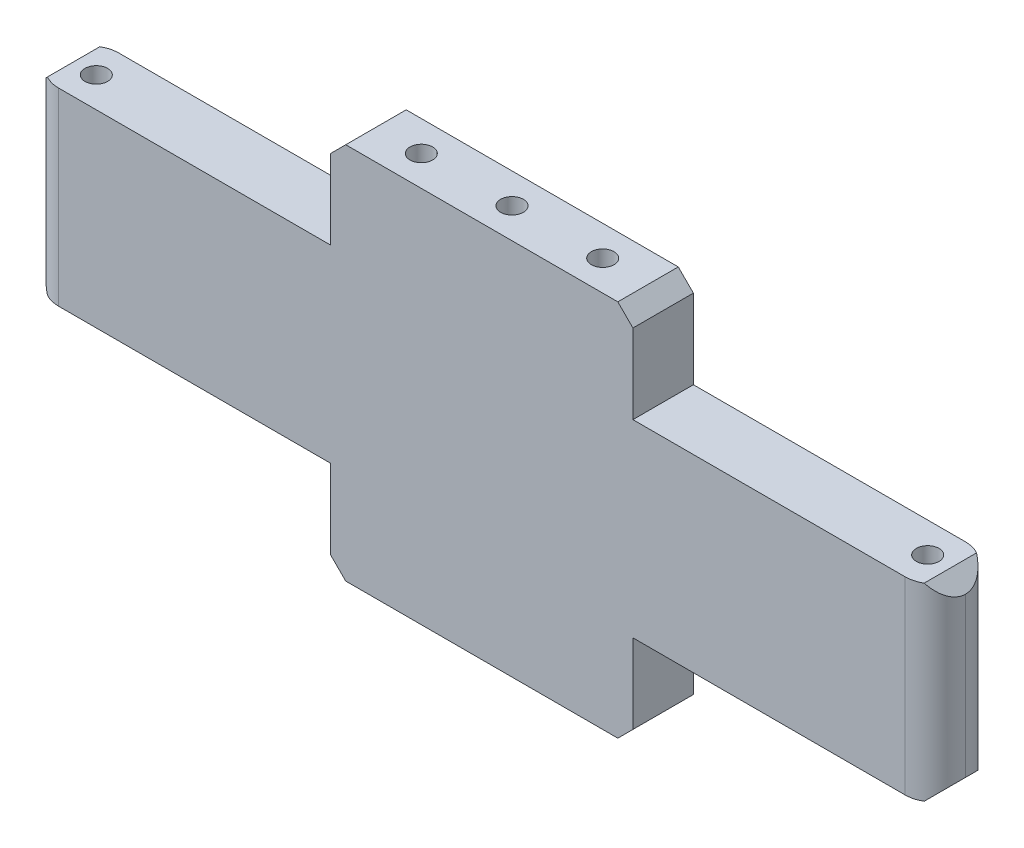
ISO-10303-21;
HEADER;
FILE_DESCRIPTION(('STEP AP214'),'2;1');
FILE_NAME('part.step','',(''),(''),'','','');
FILE_SCHEMA(('AUTOMOTIVE_DESIGN { 1 0 10303 214 1 1 1 1 }'));
ENDSEC;
DATA;
#1=APPLICATION_CONTEXT('core data for automotive mechanical design processes');
#2=APPLICATION_PROTOCOL_DEFINITION('international standard','automotive_design',2000,#1);
#3=PRODUCT_CONTEXT('',#1,'mechanical');
#4=PRODUCT('Part','Part','',(#3));
#5=PRODUCT_RELATED_PRODUCT_CATEGORY('part','',(#4));
#6=PRODUCT_DEFINITION_FORMATION('','',#4);
#7=PRODUCT_DEFINITION_CONTEXT('part definition',#1,'design');
#8=PRODUCT_DEFINITION('design','',#6,#7);
#9=PRODUCT_DEFINITION_SHAPE('','',#8);
#10=(LENGTH_UNIT() NAMED_UNIT(*) SI_UNIT(.MILLI.,.METRE.));
#11=(NAMED_UNIT(*) PLANE_ANGLE_UNIT() SI_UNIT($,.RADIAN.));
#12=(NAMED_UNIT(*) SI_UNIT($,.STERADIAN.) SOLID_ANGLE_UNIT());
#13=UNCERTAINTY_MEASURE_WITH_UNIT(LENGTH_MEASURE(1.E-05),#10,'distance_accuracy_value','');
#14=(GEOMETRIC_REPRESENTATION_CONTEXT(3) GLOBAL_UNCERTAINTY_ASSIGNED_CONTEXT((#13)) GLOBAL_UNIT_ASSIGNED_CONTEXT((#10,
#11,#12)) REPRESENTATION_CONTEXT('',''));
#15=CARTESIAN_POINT('',(0.,0.,0.));
#16=DIRECTION('',(0.,0.,1.));
#17=DIRECTION('',(1.,0.,0.));
#18=AXIS2_PLACEMENT_3D('',#15,#16,#17);
#19=CARTESIAN_POINT('',(-55.,-24.9999999999999,4.));
#20=DIRECTION('',(0.,1.,0.));
#21=DIRECTION('',(1.,0.,0.));
#22=AXIS2_PLACEMENT_3D('',#19,#20,#21);
#23=CYLINDRICAL_SURFACE('',#22,1.5);
#24=CARTESIAN_POINT('',(-55.,12.5000000000001,4.));
#25=DIRECTION('',(0.,-1.,0.));
#26=DIRECTION('',(1.,0.,0.));
#27=AXIS2_PLACEMENT_3D('',#24,#25,#26);
#28=CIRCLE('',#27,1.5);
#29=CARTESIAN_POINT('',(-53.5,12.5000000000001,4.));
#30=VERTEX_POINT('',#29);
#31=EDGE_CURVE('E50',#30,#30,#28,.T.);
#32=ORIENTED_EDGE('',*,*,#31,.F.);
#33=EDGE_LOOP('',(#32));
#34=FACE_BOUND('',#33,.T.);
#35=CARTESIAN_POINT('',(-55.,-12.4999999999999,4.));
#36=DIRECTION('',(0.,-1.,0.));
#37=DIRECTION('',(1.,0.,0.));
#38=AXIS2_PLACEMENT_3D('',#35,#36,#37);
#39=CIRCLE('',#38,1.5);
#40=CARTESIAN_POINT('',(-53.5,-12.4999999999999,4.));
#41=VERTEX_POINT('',#40);
#42=EDGE_CURVE('E11',#41,#41,#39,.T.);
#43=ORIENTED_EDGE('',*,*,#42,.T.);
#44=EDGE_LOOP('',(#43));
#45=FACE_BOUND('',#44,.T.);
#46=ADVANCED_FACE('F43',(#34,#45),#23,.F.);
#47=CARTESIAN_POINT('',(20.,-12.5,8.));
#48=DIRECTION('',(-1.,0.,0.));
#49=DIRECTION('',(0.,-1.,0.));
#50=AXIS2_PLACEMENT_3D('',#47,#48,#49);
#51=PLANE('',#50);
#52=DIRECTION('',(0.,1.,0.));
#53=VECTOR('',#52,1.);
#54=CARTESIAN_POINT('',(20.,-12.5,8.));
#55=LINE('',#54,#53);
#56=CARTESIAN_POINT('',(20.,-23.,8.));
#57=VERTEX_POINT('',#56);
#58=CARTESIAN_POINT('',(20.,-12.5,8.));
#59=VERTEX_POINT('',#58);
#60=EDGE_CURVE('E190',#57,#59,#55,.T.);
#61=ORIENTED_EDGE('',*,*,#60,.F.);
#62=DIRECTION('',(0.,0.,-1.));
#63=VECTOR('',#62,1.);
#64=CARTESIAN_POINT('',(20.,-23.,8.));
#65=LINE('',#64,#63);
#66=CARTESIAN_POINT('',(20.,-23.,0.));
#67=VERTEX_POINT('',#66);
#68=EDGE_CURVE('E218',#57,#67,#65,.T.);
#69=ORIENTED_EDGE('',*,*,#68,.T.);
#70=DIRECTION('',(0.,1.,0.));
#71=VECTOR('',#70,1.);
#72=CARTESIAN_POINT('',(20.,-12.5,0.));
#73=LINE('',#72,#71);
#74=CARTESIAN_POINT('',(20.,-12.5,0.));
#75=VERTEX_POINT('',#74);
#76=EDGE_CURVE('E216',#67,#75,#73,.T.);
#77=ORIENTED_EDGE('',*,*,#76,.T.);
#78=DIRECTION('',(0.,0.,-1.));
#79=VECTOR('',#78,1.);
#80=CARTESIAN_POINT('',(20.,-12.5,8.));
#81=LINE('',#80,#79);
#82=EDGE_CURVE('E208',#59,#75,#81,.T.);
#83=ORIENTED_EDGE('',*,*,#82,.F.);
#84=EDGE_LOOP('',(#61,#69,#77,#83));
#85=FACE_BOUND('',#84,.T.);
#86=ADVANCED_FACE('F214',(#85),#51,.F.);
#87=CARTESIAN_POINT('',(60.,-12.5,8.));
#88=DIRECTION('',(0.,1.,0.));
#89=DIRECTION('',(-1.,0.,0.));
#90=AXIS2_PLACEMENT_3D('',#87,#88,#89);
#91=PLANE('',#90);
#92=CARTESIAN_POINT('',(55.,-12.5,4.));
#93=DIRECTION('',(0.,1.,0.));
#94=DIRECTION('',(-1.,0.,0.));
#95=AXIS2_PLACEMENT_3D('',#92,#93,#94);
#96=CIRCLE('',#95,1.5);
#97=CARTESIAN_POINT('',(53.5,-12.5,4.));
#98=VERTEX_POINT('',#97);
#99=EDGE_CURVE('E314',#98,#98,#96,.T.);
#100=ORIENTED_EDGE('',*,*,#99,.T.);
#101=EDGE_LOOP('',(#100));
#102=FACE_BOUND('',#101,.T.);
#103=DIRECTION('',(1.,0.,0.));
#104=VECTOR('',#103,1.);
#105=CARTESIAN_POINT('',(60.,-12.5,0.));
#106=LINE('',#105,#104);
#107=CARTESIAN_POINT('',(56.,-12.5,0.));
#108=VERTEX_POINT('',#107);
#109=EDGE_CURVE('E380',#75,#108,#106,.T.);
#110=ORIENTED_EDGE('',*,*,#109,.T.);
#111=CARTESIAN_POINT('',(56.,-12.5,4.));
#112=DIRECTION('',(0.,1.,0.));
#113=DIRECTION('',(-1.,0.,0.));
#114=AXIS2_PLACEMENT_3D('',#111,#112,#113);
#115=CIRCLE('',#114,4.);
#116=CARTESIAN_POINT('',(58.,-12.5,0.535898384862246));
#117=VERTEX_POINT('',#116);
#118=EDGE_CURVE('E284',#108,#117,#115,.F.);
#119=ORIENTED_EDGE('',*,*,#118,.T.);
#120=DIRECTION('',(0.,0.,1.));
#121=VECTOR('',#120,1.);
#122=CARTESIAN_POINT('',(58.,-12.5,8.));
#123=LINE('',#122,#121);
#124=CARTESIAN_POINT('',(58.,-12.5,7.46410161513775));
#125=VERTEX_POINT('',#124);
#126=EDGE_CURVE('E262',#117,#125,#123,.T.);
#127=ORIENTED_EDGE('',*,*,#126,.T.);
#128=CARTESIAN_POINT('',(56.,-12.5,4.));
#129=DIRECTION('',(0.,1.,0.));
#130=DIRECTION('',(-1.,0.,0.));
#131=AXIS2_PLACEMENT_3D('',#128,#129,#130);
#132=CIRCLE('',#131,4.);
#133=CARTESIAN_POINT('',(56.,-12.5,8.));
#134=VERTEX_POINT('',#133);
#135=EDGE_CURVE('E211',#125,#134,#132,.F.);
#136=ORIENTED_EDGE('',*,*,#135,.T.);
#137=DIRECTION('',(1.,0.,0.));
#138=VECTOR('',#137,1.);
#139=CARTESIAN_POINT('',(60.,-12.5,8.));
#140=LINE('',#139,#138);
#141=EDGE_CURVE('E193',#59,#134,#140,.T.);
#142=ORIENTED_EDGE('',*,*,#141,.F.);
#143=ORIENTED_EDGE('',*,*,#82,.T.);
#144=EDGE_LOOP('',(#110,#119,#127,#136,#142,#143));
#145=FACE_BOUND('',#144,.T.);
#146=ADVANCED_FACE('F207',(#102,#145),#91,.F.);
#147=CARTESIAN_POINT('',(20.,12.5,8.));
#148=DIRECTION('',(0.,-1.,0.));
#149=DIRECTION('',(1.,0.,0.));
#150=AXIS2_PLACEMENT_3D('',#147,#148,#149);
#151=PLANE('',#150);
#152=CARTESIAN_POINT('',(55.,12.5,4.));
#153=DIRECTION('',(0.,1.,0.));
#154=DIRECTION('',(-1.,0.,0.));
#155=AXIS2_PLACEMENT_3D('',#152,#153,#154);
#156=CIRCLE('',#155,1.5);
#157=CARTESIAN_POINT('',(53.5,12.5,4.));
#158=VERTEX_POINT('',#157);
#159=EDGE_CURVE('E465',#158,#158,#156,.T.);
#160=ORIENTED_EDGE('',*,*,#159,.F.);
#161=EDGE_LOOP('',(#160));
#162=FACE_BOUND('',#161,.T.);
#163=DIRECTION('',(0.,0.,-1.));
#164=VECTOR('',#163,1.);
#165=CARTESIAN_POINT('',(58.,12.5,8.));
#166=LINE('',#165,#164);
#167=CARTESIAN_POINT('',(58.,12.5,7.46410161513776));
#168=VERTEX_POINT('',#167);
#169=CARTESIAN_POINT('',(58.,12.5,0.535898384862247));
#170=VERTEX_POINT('',#169);
#171=EDGE_CURVE('E259',#168,#170,#166,.T.);
#172=ORIENTED_EDGE('',*,*,#171,.T.);
#173=CARTESIAN_POINT('',(56.,12.5,4.));
#174=DIRECTION('',(0.,-1.,0.));
#175=DIRECTION('',(1.,0.,0.));
#176=AXIS2_PLACEMENT_3D('',#173,#174,#175);
#177=CIRCLE('',#176,4.);
#178=CARTESIAN_POINT('',(56.,12.5,0.));
#179=VERTEX_POINT('',#178);
#180=EDGE_CURVE('E275',#170,#179,#177,.F.);
#181=ORIENTED_EDGE('',*,*,#180,.T.);
#182=DIRECTION('',(-1.,0.,0.));
#183=VECTOR('',#182,1.);
#184=CARTESIAN_POINT('',(20.,12.5,0.));
#185=LINE('',#184,#183);
#186=CARTESIAN_POINT('',(20.,12.5,0.));
#187=VERTEX_POINT('',#186);
#188=EDGE_CURVE('E383',#179,#187,#185,.T.);
#189=ORIENTED_EDGE('',*,*,#188,.T.);
#190=DIRECTION('',(0.,0.,-1.));
#191=VECTOR('',#190,1.);
#192=CARTESIAN_POINT('',(20.,12.5,8.));
#193=LINE('',#192,#191);
#194=CARTESIAN_POINT('',(20.,12.5,8.));
#195=VERTEX_POINT('',#194);
#196=EDGE_CURVE('E219',#195,#187,#193,.T.);
#197=ORIENTED_EDGE('',*,*,#196,.F.);
#198=DIRECTION('',(-1.,0.,0.));
#199=VECTOR('',#198,1.);
#200=CARTESIAN_POINT('',(20.,12.5,8.));
#201=LINE('',#200,#199);
#202=CARTESIAN_POINT('',(56.,12.5,8.));
#203=VERTEX_POINT('',#202);
#204=EDGE_CURVE('E212',#203,#195,#201,.T.);
#205=ORIENTED_EDGE('',*,*,#204,.F.);
#206=CARTESIAN_POINT('',(56.,12.5,4.));
#207=DIRECTION('',(0.,-1.,0.));
#208=DIRECTION('',(1.,0.,0.));
#209=AXIS2_PLACEMENT_3D('',#206,#207,#208);
#210=CIRCLE('',#209,4.);
#211=EDGE_CURVE('E273',#203,#168,#210,.F.);
#212=ORIENTED_EDGE('',*,*,#211,.T.);
#213=EDGE_LOOP('',(#172,#181,#189,#197,#205,#212));
#214=FACE_BOUND('',#213,.T.);
#215=ADVANCED_FACE('F442',(#162,#214),#151,.F.);
#216=CARTESIAN_POINT('',(20.,25.,8.));
#217=DIRECTION('',(-1.,0.,0.));
#218=DIRECTION('',(0.,-1.,0.));
#219=AXIS2_PLACEMENT_3D('',#216,#217,#218);
#220=PLANE('',#219);
#221=DIRECTION('',(0.,1.,0.));
#222=VECTOR('',#221,1.);
#223=CARTESIAN_POINT('',(20.,25.,0.));
#224=LINE('',#223,#222);
#225=CARTESIAN_POINT('',(20.,23.,0.));
#226=VERTEX_POINT('',#225);
#227=EDGE_CURVE('E385',#187,#226,#224,.T.);
#228=ORIENTED_EDGE('',*,*,#227,.T.);
#229=DIRECTION('',(0.,0.,1.));
#230=VECTOR('',#229,1.);
#231=CARTESIAN_POINT('',(20.,23.,8.));
#232=LINE('',#231,#230);
#233=CARTESIAN_POINT('',(20.,23.,8.));
#234=VERTEX_POINT('',#233);
#235=EDGE_CURVE('E257',#226,#234,#232,.T.);
#236=ORIENTED_EDGE('',*,*,#235,.T.);
#237=DIRECTION('',(0.,1.,0.));
#238=VECTOR('',#237,1.);
#239=CARTESIAN_POINT('',(20.,25.,8.));
#240=LINE('',#239,#238);
#241=EDGE_CURVE('E408',#195,#234,#240,.T.);
#242=ORIENTED_EDGE('',*,*,#241,.F.);
#243=ORIENTED_EDGE('',*,*,#196,.T.);
#244=EDGE_LOOP('',(#228,#236,#242,#243));
#245=FACE_BOUND('',#244,.T.);
#246=ADVANCED_FACE('F473',(#245),#220,.F.);
#247=CARTESIAN_POINT('',(-20.,25.,8.));
#248=DIRECTION('',(0.,-1.,0.));
#249=DIRECTION('',(0.,0.,-1.));
#250=AXIS2_PLACEMENT_3D('',#247,#248,#249);
#251=PLANE('',#250);
#252=CARTESIAN_POINT('',(-12.,25.,4.));
#253=DIRECTION('',(0.,1.,0.));
#254=DIRECTION('',(0.,0.,1.));
#255=AXIS2_PLACEMENT_3D('',#252,#253,#254);
#256=CIRCLE('',#255,1.5);
#257=CARTESIAN_POINT('',(-12.,25.,5.5));
#258=VERTEX_POINT('',#257);
#259=EDGE_CURVE('E458',#258,#258,#256,.T.);
#260=ORIENTED_EDGE('',*,*,#259,.F.);
#261=EDGE_LOOP('',(#260));
#262=FACE_BOUND('',#261,.T.);
#263=CARTESIAN_POINT('',(0.,25.,4.));
#264=DIRECTION('',(0.,1.,0.));
#265=DIRECTION('',(0.,0.,1.));
#266=AXIS2_PLACEMENT_3D('',#263,#264,#265);
#267=CIRCLE('',#266,1.5);
#268=CARTESIAN_POINT('',(0.,25.,5.5));
#269=VERTEX_POINT('',#268);
#270=EDGE_CURVE('E455',#269,#269,#267,.T.);
#271=ORIENTED_EDGE('',*,*,#270,.F.);
#272=EDGE_LOOP('',(#271));
#273=FACE_BOUND('',#272,.T.);
#274=CARTESIAN_POINT('',(12.,25.,4.));
#275=DIRECTION('',(0.,1.,0.));
#276=DIRECTION('',(0.,0.,1.));
#277=AXIS2_PLACEMENT_3D('',#274,#275,#276);
#278=CIRCLE('',#277,1.5);
#279=CARTESIAN_POINT('',(12.,25.,5.5));
#280=VERTEX_POINT('',#279);
#281=EDGE_CURVE('E449',#280,#280,#278,.T.);
#282=ORIENTED_EDGE('',*,*,#281,.F.);
#283=EDGE_LOOP('',(#282));
#284=FACE_BOUND('',#283,.T.);
#285=DIRECTION('',(-1.,0.,0.));
#286=VECTOR('',#285,1.);
#287=CARTESIAN_POINT('',(-20.,25.,0.));
#288=LINE('',#287,#286);
#289=CARTESIAN_POINT('',(18.,25.,0.));
#290=VERTEX_POINT('',#289);
#291=CARTESIAN_POINT('',(-18.,25.,0.));
#292=VERTEX_POINT('',#291);
#293=EDGE_CURVE('E357',#290,#292,#288,.T.);
#294=ORIENTED_EDGE('',*,*,#293,.T.);
#295=DIRECTION('',(0.,0.,1.));
#296=VECTOR('',#295,1.);
#297=CARTESIAN_POINT('',(-18.,25.,8.));
#298=LINE('',#297,#296);
#299=CARTESIAN_POINT('',(-18.,25.,8.));
#300=VERTEX_POINT('',#299);
#301=EDGE_CURVE('E255',#292,#300,#298,.T.);
#302=ORIENTED_EDGE('',*,*,#301,.T.);
#303=DIRECTION('',(-1.,0.,0.));
#304=VECTOR('',#303,1.);
#305=CARTESIAN_POINT('',(-20.,25.,8.));
#306=LINE('',#305,#304);
#307=CARTESIAN_POINT('',(18.,25.,8.));
#308=VERTEX_POINT('',#307);
#309=EDGE_CURVE('E402',#308,#300,#306,.T.);
#310=ORIENTED_EDGE('',*,*,#309,.F.);
#311=DIRECTION('',(0.,0.,-1.));
#312=VECTOR('',#311,1.);
#313=CARTESIAN_POINT('',(18.,25.,8.));
#314=LINE('',#313,#312);
#315=EDGE_CURVE('E252',#308,#290,#314,.T.);
#316=ORIENTED_EDGE('',*,*,#315,.T.);
#317=EDGE_LOOP('',(#294,#302,#310,#316));
#318=FACE_BOUND('',#317,.T.);
#319=ADVANCED_FACE('F391',(#262,#273,#284,#318),#251,.F.);
#320=CARTESIAN_POINT('',(-20.,25.,8.));
#321=DIRECTION('',(1.,0.,0.));
#322=DIRECTION('',(0.,1.,0.));
#323=AXIS2_PLACEMENT_3D('',#320,#321,#322);
#324=PLANE('',#323);
#325=DIRECTION('',(0.,-1.,0.));
#326=VECTOR('',#325,1.);
#327=CARTESIAN_POINT('',(-20.,25.,8.));
#328=LINE('',#327,#326);
#329=CARTESIAN_POINT('',(-20.,23.,8.));
#330=VERTEX_POINT('',#329);
#331=CARTESIAN_POINT('',(-20.,12.5,8.));
#332=VERTEX_POINT('',#331);
#333=EDGE_CURVE('E401',#330,#332,#328,.T.);
#334=ORIENTED_EDGE('',*,*,#333,.F.);
#335=DIRECTION('',(0.,0.,-1.));
#336=VECTOR('',#335,1.);
#337=CARTESIAN_POINT('',(-20.,23.,8.));
#338=LINE('',#337,#336);
#339=CARTESIAN_POINT('',(-20.,23.,0.));
#340=VERTEX_POINT('',#339);
#341=EDGE_CURVE('E249',#330,#340,#338,.T.);
#342=ORIENTED_EDGE('',*,*,#341,.T.);
#343=DIRECTION('',(0.,-1.,0.));
#344=VECTOR('',#343,1.);
#345=CARTESIAN_POINT('',(-20.,25.,0.));
#346=LINE('',#345,#344);
#347=CARTESIAN_POINT('',(-20.,12.5,0.));
#348=VERTEX_POINT('',#347);
#349=EDGE_CURVE('E353',#340,#348,#346,.T.);
#350=ORIENTED_EDGE('',*,*,#349,.T.);
#351=DIRECTION('',(0.,0.,-1.));
#352=VECTOR('',#351,1.);
#353=CARTESIAN_POINT('',(-20.,12.5,8.));
#354=LINE('',#353,#352);
#355=EDGE_CURVE('E224',#332,#348,#354,.T.);
#356=ORIENTED_EDGE('',*,*,#355,.F.);
#357=EDGE_LOOP('',(#334,#342,#350,#356));
#358=FACE_BOUND('',#357,.T.);
#359=ADVANCED_FACE('F404',(#358),#324,.F.);
#360=CARTESIAN_POINT('',(-20.,12.5,8.));
#361=DIRECTION('',(0.,-1.,0.));
#362=DIRECTION('',(1.,0.,0.));
#363=AXIS2_PLACEMENT_3D('',#360,#361,#362);
#364=PLANE('',#363);
#365=ORIENTED_EDGE('',*,*,#31,.T.);
#366=EDGE_LOOP('',(#365));
#367=FACE_BOUND('',#366,.T.);
#368=DIRECTION('',(-1.,0.,0.));
#369=VECTOR('',#368,1.);
#370=CARTESIAN_POINT('',(-20.,12.5,0.));
#371=LINE('',#370,#369);
#372=CARTESIAN_POINT('',(-56.,12.5,0.));
#373=VERTEX_POINT('',#372);
#374=EDGE_CURVE('E347',#348,#373,#371,.T.);
#375=ORIENTED_EDGE('',*,*,#374,.T.);
#376=CARTESIAN_POINT('',(-56.,12.5,4.));
#377=DIRECTION('',(0.,-1.,0.));
#378=DIRECTION('',(1.,0.,0.));
#379=AXIS2_PLACEMENT_3D('',#376,#377,#378);
#380=CIRCLE('',#379,4.);
#381=CARTESIAN_POINT('',(-58.,12.5,0.53589838486223));
#382=VERTEX_POINT('',#381);
#383=EDGE_CURVE('E304',#373,#382,#380,.F.);
#384=ORIENTED_EDGE('',*,*,#383,.T.);
#385=DIRECTION('',(0.,0.,1.));
#386=VECTOR('',#385,1.);
#387=CARTESIAN_POINT('',(-58.,12.5,8.));
#388=LINE('',#387,#386);
#389=CARTESIAN_POINT('',(-58.,12.5,7.46410161513777));
#390=VERTEX_POINT('',#389);
#391=EDGE_CURVE('E264',#382,#390,#388,.T.);
#392=ORIENTED_EDGE('',*,*,#391,.T.);
#393=CARTESIAN_POINT('',(-56.,12.5,4.));
#394=DIRECTION('',(0.,-1.,0.));
#395=DIRECTION('',(1.,0.,0.));
#396=AXIS2_PLACEMENT_3D('',#393,#394,#395);
#397=CIRCLE('',#396,4.);
#398=CARTESIAN_POINT('',(-56.,12.5,8.));
#399=VERTEX_POINT('',#398);
#400=EDGE_CURVE('E302',#390,#399,#397,.F.);
#401=ORIENTED_EDGE('',*,*,#400,.T.);
#402=DIRECTION('',(-1.,0.,0.));
#403=VECTOR('',#402,1.);
#404=CARTESIAN_POINT('',(-20.,12.5,8.));
#405=LINE('',#404,#403);
#406=EDGE_CURVE('E405',#332,#399,#405,.T.);
#407=ORIENTED_EDGE('',*,*,#406,.F.);
#408=ORIENTED_EDGE('',*,*,#355,.T.);
#409=EDGE_LOOP('',(#375,#384,#392,#401,#407,#408));
#410=FACE_BOUND('',#409,.T.);
#411=ADVANCED_FACE('F318',(#367,#410),#364,.F.);
#412=CARTESIAN_POINT('',(-60.,-12.5,8.));
#413=DIRECTION('',(0.,1.,0.));
#414=DIRECTION('',(-1.,0.,0.));
#415=AXIS2_PLACEMENT_3D('',#412,#413,#414);
#416=PLANE('',#415);
#417=ORIENTED_EDGE('',*,*,#42,.F.);
#418=EDGE_LOOP('',(#417));
#419=FACE_BOUND('',#418,.T.);
#420=DIRECTION('',(0.,0.,-1.));
#421=VECTOR('',#420,1.);
#422=CARTESIAN_POINT('',(-58.,-12.5,8.));
#423=LINE('',#422,#421);
#424=CARTESIAN_POINT('',(-58.,-12.5,7.46410161513775));
#425=VERTEX_POINT('',#424);
#426=CARTESIAN_POINT('',(-58.,-12.5,0.535898384862247));
#427=VERTEX_POINT('',#426);
#428=EDGE_CURVE('E266',#425,#427,#423,.T.);
#429=ORIENTED_EDGE('',*,*,#428,.T.);
#430=CARTESIAN_POINT('',(-56.,-12.5,4.));
#431=DIRECTION('',(0.,1.,0.));
#432=DIRECTION('',(-1.,0.,0.));
#433=AXIS2_PLACEMENT_3D('',#430,#431,#432);
#434=CIRCLE('',#433,4.);
#435=CARTESIAN_POINT('',(-56.,-12.5,0.));
#436=VERTEX_POINT('',#435);
#437=EDGE_CURVE('E300',#427,#436,#434,.F.);
#438=ORIENTED_EDGE('',*,*,#437,.T.);
#439=DIRECTION('',(1.,0.,0.));
#440=VECTOR('',#439,1.);
#441=CARTESIAN_POINT('',(-60.,-12.5,0.));
#442=LINE('',#441,#440);
#443=CARTESIAN_POINT('',(-20.,-12.5,0.));
#444=VERTEX_POINT('',#443);
#445=EDGE_CURVE('E349',#436,#444,#442,.T.);
#446=ORIENTED_EDGE('',*,*,#445,.T.);
#447=DIRECTION('',(0.,0.,-1.));
#448=VECTOR('',#447,1.);
#449=CARTESIAN_POINT('',(-20.,-12.5,8.));
#450=LINE('',#449,#448);
#451=CARTESIAN_POINT('',(-20.,-12.5,8.));
#452=VERTEX_POINT('',#451);
#453=EDGE_CURVE('E365',#452,#444,#450,.T.);
#454=ORIENTED_EDGE('',*,*,#453,.F.);
#455=DIRECTION('',(1.,0.,0.));
#456=VECTOR('',#455,1.);
#457=CARTESIAN_POINT('',(-60.,-12.5,8.));
#458=LINE('',#457,#456);
#459=CARTESIAN_POINT('',(-56.,-12.5,8.));
#460=VERTEX_POINT('',#459);
#461=EDGE_CURVE('E375',#460,#452,#458,.T.);
#462=ORIENTED_EDGE('',*,*,#461,.F.);
#463=CARTESIAN_POINT('',(-56.,-12.5,4.));
#464=DIRECTION('',(0.,1.,0.));
#465=DIRECTION('',(-1.,0.,0.));
#466=AXIS2_PLACEMENT_3D('',#463,#464,#465);
#467=CIRCLE('',#466,4.);
#468=EDGE_CURVE('E298',#460,#425,#467,.F.);
#469=ORIENTED_EDGE('',*,*,#468,.T.);
#470=EDGE_LOOP('',(#429,#438,#446,#454,#462,#469));
#471=FACE_BOUND('',#470,.T.);
#472=ADVANCED_FACE('F325',(#419,#471),#416,.F.);
#473=CARTESIAN_POINT('',(-20.,-12.5,8.));
#474=DIRECTION('',(1.,0.,0.));
#475=DIRECTION('',(0.,1.,0.));
#476=AXIS2_PLACEMENT_3D('',#473,#474,#475);
#477=PLANE('',#476);
#478=DIRECTION('',(0.,-1.,0.));
#479=VECTOR('',#478,1.);
#480=CARTESIAN_POINT('',(-20.,-12.5,0.));
#481=LINE('',#480,#479);
#482=CARTESIAN_POINT('',(-20.,-23.,0.));
#483=VERTEX_POINT('',#482);
#484=EDGE_CURVE('E355',#444,#483,#481,.T.);
#485=ORIENTED_EDGE('',*,*,#484,.T.);
#486=DIRECTION('',(0.,0.,1.));
#487=VECTOR('',#486,1.);
#488=CARTESIAN_POINT('',(-20.,-23.,8.));
#489=LINE('',#488,#487);
#490=CARTESIAN_POINT('',(-20.,-23.,8.));
#491=VERTEX_POINT('',#490);
#492=EDGE_CURVE('E247',#483,#491,#489,.T.);
#493=ORIENTED_EDGE('',*,*,#492,.T.);
#494=DIRECTION('',(0.,-1.,0.));
#495=VECTOR('',#494,1.);
#496=CARTESIAN_POINT('',(-20.,-12.5,8.));
#497=LINE('',#496,#495);
#498=EDGE_CURVE('E371',#452,#491,#497,.T.);
#499=ORIENTED_EDGE('',*,*,#498,.F.);
#500=ORIENTED_EDGE('',*,*,#453,.T.);
#501=EDGE_LOOP('',(#485,#493,#499,#500));
#502=FACE_BOUND('',#501,.T.);
#503=ADVANCED_FACE('F328',(#502),#477,.F.);
#504=CARTESIAN_POINT('',(-20.,-25.,8.));
#505=DIRECTION('',(0.,1.,0.));
#506=DIRECTION('',(0.,0.,1.));
#507=AXIS2_PLACEMENT_3D('',#504,#505,#506);
#508=PLANE('',#507);
#509=CARTESIAN_POINT('',(-12.,-25.,4.));
#510=DIRECTION('',(0.,1.,0.));
#511=DIRECTION('',(0.,0.,1.));
#512=AXIS2_PLACEMENT_3D('',#509,#510,#511);
#513=CIRCLE('',#512,1.5);
#514=CARTESIAN_POINT('',(-12.,-25.,5.5));
#515=VERTEX_POINT('',#514);
#516=EDGE_CURVE('E381',#515,#515,#513,.T.);
#517=ORIENTED_EDGE('',*,*,#516,.T.);
#518=EDGE_LOOP('',(#517));
#519=FACE_BOUND('',#518,.T.);
#520=CARTESIAN_POINT('',(0.,-25.,4.));
#521=DIRECTION('',(0.,1.,0.));
#522=DIRECTION('',(0.,0.,1.));
#523=AXIS2_PLACEMENT_3D('',#520,#521,#522);
#524=CIRCLE('',#523,1.5);
#525=CARTESIAN_POINT('',(0.,-25.,5.5));
#526=VERTEX_POINT('',#525);
#527=EDGE_CURVE('E452',#526,#526,#524,.T.);
#528=ORIENTED_EDGE('',*,*,#527,.T.);
#529=EDGE_LOOP('',(#528));
#530=FACE_BOUND('',#529,.T.);
#531=CARTESIAN_POINT('',(12.,-25.,4.));
#532=DIRECTION('',(0.,1.,0.));
#533=DIRECTION('',(0.,0.,1.));
#534=AXIS2_PLACEMENT_3D('',#531,#532,#533);
#535=CIRCLE('',#534,1.5);
#536=CARTESIAN_POINT('',(12.,-25.,5.5));
#537=VERTEX_POINT('',#536);
#538=EDGE_CURVE('E311',#537,#537,#535,.T.);
#539=ORIENTED_EDGE('',*,*,#538,.T.);
#540=EDGE_LOOP('',(#539));
#541=FACE_BOUND('',#540,.T.);
#542=DIRECTION('',(1.,0.,0.));
#543=VECTOR('',#542,1.);
#544=CARTESIAN_POINT('',(-20.,-25.,0.));
#545=LINE('',#544,#543);
#546=CARTESIAN_POINT('',(-18.,-25.,0.));
#547=VERTEX_POINT('',#546);
#548=CARTESIAN_POINT('',(18.,-25.,0.));
#549=VERTEX_POINT('',#548);
#550=EDGE_CURVE('E202',#547,#549,#545,.T.);
#551=ORIENTED_EDGE('',*,*,#550,.T.);
#552=DIRECTION('',(0.,0.,1.));
#553=VECTOR('',#552,1.);
#554=CARTESIAN_POINT('',(18.,-25.,8.));
#555=LINE('',#554,#553);
#556=CARTESIAN_POINT('',(18.,-25.,8.));
#557=VERTEX_POINT('',#556);
#558=EDGE_CURVE('E238',#549,#557,#555,.T.);
#559=ORIENTED_EDGE('',*,*,#558,.T.);
#560=DIRECTION('',(1.,0.,0.));
#561=VECTOR('',#560,1.);
#562=CARTESIAN_POINT('',(-20.,-25.,8.));
#563=LINE('',#562,#561);
#564=CARTESIAN_POINT('',(-18.,-25.,8.));
#565=VERTEX_POINT('',#564);
#566=EDGE_CURVE('E367',#565,#557,#563,.T.);
#567=ORIENTED_EDGE('',*,*,#566,.F.);
#568=DIRECTION('',(0.,0.,-1.));
#569=VECTOR('',#568,1.);
#570=CARTESIAN_POINT('',(-18.,-25.,8.));
#571=LINE('',#570,#569);
#572=EDGE_CURVE('E235',#565,#547,#571,.T.);
#573=ORIENTED_EDGE('',*,*,#572,.T.);
#574=EDGE_LOOP('',(#551,#559,#567,#573));
#575=FACE_BOUND('',#574,.T.);
#576=ADVANCED_FACE('F418',(#519,#530,#541,#575),#508,.F.);
#577=CARTESIAN_POINT('',(0.,0.,8.));
#578=DIRECTION('',(0.,0.,1.));
#579=DIRECTION('',(1.,0.,0.));
#580=AXIS2_PLACEMENT_3D('',#577,#578,#579);
#581=PLANE('',#580);
#582=ORIENTED_EDGE('',*,*,#141,.T.);
#583=DIRECTION('',(0.,1.,0.));
#584=VECTOR('',#583,1.);
#585=CARTESIAN_POINT('',(56.,10.5,8.));
#586=LINE('',#585,#584);
#587=EDGE_CURVE('E292',#134,#203,#586,.T.);
#588=ORIENTED_EDGE('',*,*,#587,.T.);
#589=ORIENTED_EDGE('',*,*,#204,.T.);
#590=ORIENTED_EDGE('',*,*,#241,.T.);
#591=DIRECTION('',(0.707106781186545,-0.70710678118655,0.));
#592=VECTOR('',#591,1.);
#593=CARTESIAN_POINT('',(21.5000000000001,21.4999999999999,8.));
#594=LINE('',#593,#592);
#595=EDGE_CURVE('E240',#234,#308,#594,.F.);
#596=ORIENTED_EDGE('',*,*,#595,.T.);
#597=ORIENTED_EDGE('',*,*,#309,.T.);
#598=DIRECTION('',(0.707106781186548,0.707106781186548,0.));
#599=VECTOR('',#598,1.);
#600=CARTESIAN_POINT('',(-21.5,21.5,8.));
#601=LINE('',#600,#599);
#602=EDGE_CURVE('E242',#300,#330,#601,.F.);
#603=ORIENTED_EDGE('',*,*,#602,.T.);
#604=ORIENTED_EDGE('',*,*,#333,.T.);
#605=ORIENTED_EDGE('',*,*,#406,.T.);
#606=DIRECTION('',(0.,-1.,0.));
#607=VECTOR('',#606,1.);
#608=CARTESIAN_POINT('',(-56.,-10.5,8.));
#609=LINE('',#608,#607);
#610=EDGE_CURVE('E290',#399,#460,#609,.T.);
#611=ORIENTED_EDGE('',*,*,#610,.T.);
#612=ORIENTED_EDGE('',*,*,#461,.T.);
#613=ORIENTED_EDGE('',*,*,#498,.T.);
#614=DIRECTION('',(-0.707106781186545,0.70710678118655,0.));
#615=VECTOR('',#614,1.);
#616=CARTESIAN_POINT('',(-21.5000000000001,-21.4999999999999,8.));
#617=LINE('',#616,#615);
#618=EDGE_CURVE('E244',#491,#565,#617,.F.);
#619=ORIENTED_EDGE('',*,*,#618,.T.);
#620=ORIENTED_EDGE('',*,*,#566,.T.);
#621=DIRECTION('',(-0.70710678118655,-0.707106781186545,0.));
#622=VECTOR('',#621,1.);
#623=CARTESIAN_POINT('',(21.4999999999999,-21.5000000000001,8.));
#624=LINE('',#623,#622);
#625=EDGE_CURVE('E197',#557,#57,#624,.F.);
#626=ORIENTED_EDGE('',*,*,#625,.T.);
#627=ORIENTED_EDGE('',*,*,#60,.T.);
#628=EDGE_LOOP('',(#582,#588,#589,#590,#596,#597,#603,#604,#605,#611,#612,#613,#619,#620,#626,#627));
#629=FACE_BOUND('',#628,.T.);
#630=ADVANCED_FACE('F192',(#629),#581,.T.);
#631=CARTESIAN_POINT('',(0.,0.,0.));
#632=DIRECTION('',(0.,0.,1.));
#633=DIRECTION('',(1.,0.,0.));
#634=AXIS2_PLACEMENT_3D('',#631,#632,#633);
#635=PLANE('',#634);
#636=ORIENTED_EDGE('',*,*,#188,.F.);
#637=DIRECTION('',(0.,1.,0.));
#638=VECTOR('',#637,1.);
#639=CARTESIAN_POINT('',(56.,0.,0.));
#640=LINE('',#639,#638);
#641=EDGE_CURVE('E280',#179,#108,#640,.F.);
#642=ORIENTED_EDGE('',*,*,#641,.T.);
#643=ORIENTED_EDGE('',*,*,#109,.F.);
#644=ORIENTED_EDGE('',*,*,#76,.F.);
#645=DIRECTION('',(0.70710678118655,0.707106781186545,0.));
#646=VECTOR('',#645,1.);
#647=CARTESIAN_POINT('',(20.,-23.,0.));
#648=LINE('',#647,#646);
#649=EDGE_CURVE('E233',#67,#549,#648,.F.);
#650=ORIENTED_EDGE('',*,*,#649,.T.);
#651=ORIENTED_EDGE('',*,*,#550,.F.);
#652=DIRECTION('',(0.707106781186545,-0.70710678118655,0.));
#653=VECTOR('',#652,1.);
#654=CARTESIAN_POINT('',(-18.,-25.,0.));
#655=LINE('',#654,#653);
#656=EDGE_CURVE('E231',#547,#483,#655,.F.);
#657=ORIENTED_EDGE('',*,*,#656,.T.);
#658=ORIENTED_EDGE('',*,*,#484,.F.);
#659=ORIENTED_EDGE('',*,*,#445,.F.);
#660=DIRECTION('',(0.,-1.,0.));
#661=VECTOR('',#660,1.);
#662=CARTESIAN_POINT('',(-56.,0.,0.));
#663=LINE('',#662,#661);
#664=EDGE_CURVE('E277',#436,#373,#663,.F.);
#665=ORIENTED_EDGE('',*,*,#664,.T.);
#666=ORIENTED_EDGE('',*,*,#374,.F.);
#667=ORIENTED_EDGE('',*,*,#349,.F.);
#668=DIRECTION('',(-0.707106781186548,-0.707106781186548,0.));
#669=VECTOR('',#668,1.);
#670=CARTESIAN_POINT('',(-20.,23.,0.));
#671=LINE('',#670,#669);
#672=EDGE_CURVE('E229',#340,#292,#671,.F.);
#673=ORIENTED_EDGE('',*,*,#672,.T.);
#674=ORIENTED_EDGE('',*,*,#293,.F.);
#675=DIRECTION('',(-0.707106781186545,0.70710678118655,0.));
#676=VECTOR('',#675,1.);
#677=CARTESIAN_POINT('',(18.,25.,0.));
#678=LINE('',#677,#676);
#679=EDGE_CURVE('E221',#290,#226,#678,.F.);
#680=ORIENTED_EDGE('',*,*,#679,.T.);
#681=ORIENTED_EDGE('',*,*,#227,.F.);
#682=EDGE_LOOP('',(#636,#642,#643,#644,#650,#651,#657,#658,#659,#665,#666,#667,#673,#674,#680,#681));
#683=FACE_BOUND('',#682,.T.);
#684=ADVANCED_FACE('F345',(#683),#635,.F.);
#685=CARTESIAN_POINT('',(20.,-23.,8.));
#686=DIRECTION('',(-0.707106781186545,0.70710678118655,0.));
#687=DIRECTION('',(0.,0.,-1.));
#688=AXIS2_PLACEMENT_3D('',#685,#686,#687);
#689=PLANE('',#688);
#690=ORIENTED_EDGE('',*,*,#625,.F.);
#691=ORIENTED_EDGE('',*,*,#558,.F.);
#692=ORIENTED_EDGE('',*,*,#649,.F.);
#693=ORIENTED_EDGE('',*,*,#68,.F.);
#694=EDGE_LOOP('',(#690,#691,#692,#693));
#695=FACE_BOUND('',#694,.T.);
#696=ADVANCED_FACE('F422',(#695),#689,.F.);
#697=CARTESIAN_POINT('',(-18.,-25.,8.));
#698=DIRECTION('',(0.70710678118655,0.707106781186545,0.));
#699=DIRECTION('',(0.,0.,-1.));
#700=AXIS2_PLACEMENT_3D('',#697,#698,#699);
#701=PLANE('',#700);
#702=ORIENTED_EDGE('',*,*,#618,.F.);
#703=ORIENTED_EDGE('',*,*,#492,.F.);
#704=ORIENTED_EDGE('',*,*,#656,.F.);
#705=ORIENTED_EDGE('',*,*,#572,.F.);
#706=EDGE_LOOP('',(#702,#703,#704,#705));
#707=FACE_BOUND('',#706,.T.);
#708=ADVANCED_FACE('F415',(#707),#701,.F.);
#709=CARTESIAN_POINT('',(-20.,23.,8.));
#710=DIRECTION('',(0.707106781186547,-0.707106781186547,0.));
#711=DIRECTION('',(0.,0.,-1.));
#712=AXIS2_PLACEMENT_3D('',#709,#710,#711);
#713=PLANE('',#712);
#714=ORIENTED_EDGE('',*,*,#602,.F.);
#715=ORIENTED_EDGE('',*,*,#301,.F.);
#716=ORIENTED_EDGE('',*,*,#672,.F.);
#717=ORIENTED_EDGE('',*,*,#341,.F.);
#718=EDGE_LOOP('',(#714,#715,#716,#717));
#719=FACE_BOUND('',#718,.T.);
#720=ADVANCED_FACE('F397',(#719),#713,.F.);
#721=CARTESIAN_POINT('',(18.,25.,8.));
#722=DIRECTION('',(-0.70710678118655,-0.707106781186545,0.));
#723=DIRECTION('',(0.,0.,-1.));
#724=AXIS2_PLACEMENT_3D('',#721,#722,#723);
#725=PLANE('',#724);
#726=ORIENTED_EDGE('',*,*,#595,.F.);
#727=ORIENTED_EDGE('',*,*,#235,.F.);
#728=ORIENTED_EDGE('',*,*,#679,.F.);
#729=ORIENTED_EDGE('',*,*,#315,.F.);
#730=EDGE_LOOP('',(#726,#727,#728,#729));
#731=FACE_BOUND('',#730,.T.);
#732=ADVANCED_FACE('F503',(#731),#725,.F.);
#733=CARTESIAN_POINT('',(12.,-25.,4.));
#734=DIRECTION('',(0.,1.,0.));
#735=DIRECTION('',(0.,0.,1.));
#736=AXIS2_PLACEMENT_3D('',#733,#734,#735);
#737=CYLINDRICAL_SURFACE('',#736,1.5);
#738=ORIENTED_EDGE('',*,*,#538,.F.);
#739=EDGE_LOOP('',(#738));
#740=FACE_BOUND('',#739,.T.);
#741=ORIENTED_EDGE('',*,*,#281,.T.);
#742=EDGE_LOOP('',(#741));
#743=FACE_BOUND('',#742,.T.);
#744=ADVANCED_FACE('F509',(#740,#743),#737,.F.);
#745=CARTESIAN_POINT('',(0.,-25.,4.));
#746=DIRECTION('',(0.,1.,0.));
#747=DIRECTION('',(0.,0.,1.));
#748=AXIS2_PLACEMENT_3D('',#745,#746,#747);
#749=CYLINDRICAL_SURFACE('',#748,1.5);
#750=ORIENTED_EDGE('',*,*,#527,.F.);
#751=EDGE_LOOP('',(#750));
#752=FACE_BOUND('',#751,.T.);
#753=ORIENTED_EDGE('',*,*,#270,.T.);
#754=EDGE_LOOP('',(#753));
#755=FACE_BOUND('',#754,.T.);
#756=ADVANCED_FACE('F641',(#752,#755),#749,.F.);
#757=CARTESIAN_POINT('',(-12.,-25.,4.));
#758=DIRECTION('',(0.,1.,0.));
#759=DIRECTION('',(0.,0.,1.));
#760=AXIS2_PLACEMENT_3D('',#757,#758,#759);
#761=CYLINDRICAL_SURFACE('',#760,1.5);
#762=ORIENTED_EDGE('',*,*,#516,.F.);
#763=EDGE_LOOP('',(#762));
#764=FACE_BOUND('',#763,.T.);
#765=ORIENTED_EDGE('',*,*,#259,.T.);
#766=EDGE_LOOP('',(#765));
#767=FACE_BOUND('',#766,.T.);
#768=ADVANCED_FACE('F517',(#764,#767),#761,.F.);
#769=CARTESIAN_POINT('',(58.,12.5,8.));
#770=DIRECTION('',(-0.707106781186552,-0.707106781186542,0.));
#771=DIRECTION('',(0.,0.,-1.));
#772=AXIS2_PLACEMENT_3D('',#769,#770,#771);
#773=PLANE('',#772);
#774=CARTESIAN_POINT('',(56.,14.5000000000001,4.));
#775=DIRECTION('',(-0.707106781186552,-0.707106781186542,0.));
#776=DIRECTION('',(0.707106781186543,-0.707106781186552,0.));
#777=AXIS2_PLACEMENT_3D('',#774,#775,#776);
#778=ELLIPSE('',#777,5.65685424949242,4.);
#779=CARTESIAN_POINT('',(60.,10.5,4.));
#780=VERTEX_POINT('',#779);
#781=EDGE_CURVE('E269',#168,#780,#778,.F.);
#782=ORIENTED_EDGE('',*,*,#781,.T.);
#783=CARTESIAN_POINT('',(56.,14.5000000000001,4.));
#784=DIRECTION('',(-0.707106781186552,-0.707106781186542,0.));
#785=DIRECTION('',(-0.707106781186543,0.707106781186552,0.));
#786=AXIS2_PLACEMENT_3D('',#783,#784,#785);
#787=ELLIPSE('',#786,5.65685424949242,4.);
#788=EDGE_CURVE('E271',#780,#170,#787,.F.);
#789=ORIENTED_EDGE('',*,*,#788,.T.);
#790=ORIENTED_EDGE('',*,*,#171,.F.);
#791=EDGE_LOOP('',(#782,#789,#790));
#792=FACE_BOUND('',#791,.T.);
#793=ADVANCED_FACE('F511',(#792),#773,.F.);
#794=CARTESIAN_POINT('',(60.,-10.5,8.));
#795=DIRECTION('',(-0.707106781186545,0.70710678118655,0.));
#796=DIRECTION('',(0.,0.,-1.));
#797=AXIS2_PLACEMENT_3D('',#794,#795,#796);
#798=PLANE('',#797);
#799=ORIENTED_EDGE('',*,*,#126,.F.);
#800=CARTESIAN_POINT('',(56.,-14.5,4.));
#801=DIRECTION('',(-0.707106781186545,0.70710678118655,0.));
#802=DIRECTION('',(0.70710678118655,0.707106781186545,0.));
#803=AXIS2_PLACEMENT_3D('',#800,#801,#802);
#804=ELLIPSE('',#803,5.65685424949236,4.);
#805=CARTESIAN_POINT('',(60.,-10.5,4.));
#806=VERTEX_POINT('',#805);
#807=EDGE_CURVE('E288',#117,#806,#804,.F.);
#808=ORIENTED_EDGE('',*,*,#807,.T.);
#809=CARTESIAN_POINT('',(56.,-14.5,4.));
#810=DIRECTION('',(-0.707106781186545,0.70710678118655,0.));
#811=DIRECTION('',(-0.70710678118655,-0.707106781186545,0.));
#812=AXIS2_PLACEMENT_3D('',#809,#810,#811);
#813=ELLIPSE('',#812,5.65685424949236,4.);
#814=EDGE_CURVE('E286',#806,#125,#813,.F.);
#815=ORIENTED_EDGE('',*,*,#814,.T.);
#816=EDGE_LOOP('',(#799,#808,#815));
#817=FACE_BOUND('',#816,.T.);
#818=ADVANCED_FACE('F428',(#817),#798,.F.);
#819=CARTESIAN_POINT('',(-60.,10.5,8.));
#820=DIRECTION('',(0.707106781186542,-0.707106781186552,0.));
#821=DIRECTION('',(0.,0.,-1.));
#822=AXIS2_PLACEMENT_3D('',#819,#820,#821);
#823=PLANE('',#822);
#824=ORIENTED_EDGE('',*,*,#391,.F.);
#825=CARTESIAN_POINT('',(-56.,14.5,4.));
#826=DIRECTION('',(0.707106781186542,-0.707106781186552,0.));
#827=DIRECTION('',(-0.707106781186552,-0.707106781186543,0.));
#828=AXIS2_PLACEMENT_3D('',#825,#826,#827);
#829=ELLIPSE('',#828,5.65685424949234,4.);
#830=CARTESIAN_POINT('',(-60.,10.5,4.));
#831=VERTEX_POINT('',#830);
#832=EDGE_CURVE('E57',#382,#831,#829,.F.);
#833=ORIENTED_EDGE('',*,*,#832,.T.);
#834=CARTESIAN_POINT('',(-56.,14.5,4.));
#835=DIRECTION('',(0.707106781186542,-0.707106781186552,0.));
#836=DIRECTION('',(0.707106781186552,0.707106781186543,0.));
#837=AXIS2_PLACEMENT_3D('',#834,#835,#836);
#838=ELLIPSE('',#837,5.65685424949234,4.);
#839=EDGE_CURVE('E60',#831,#390,#838,.F.);
#840=ORIENTED_EDGE('',*,*,#839,.T.);
#841=EDGE_LOOP('',(#824,#833,#840));
#842=FACE_BOUND('',#841,.T.);
#843=ADVANCED_FACE('F524',(#842),#823,.F.);
#844=CARTESIAN_POINT('',(-58.,-12.5,8.));
#845=DIRECTION('',(0.707106781186552,0.707106781186543,0.));
#846=DIRECTION('',(0.,0.,-1.));
#847=AXIS2_PLACEMENT_3D('',#844,#845,#846);
#848=PLANE('',#847);
#849=CARTESIAN_POINT('',(-56.,-14.5,4.));
#850=DIRECTION('',(0.707106781186552,0.707106781186543,0.));
#851=DIRECTION('',(-0.707106781186543,0.707106781186552,0.));
#852=AXIS2_PLACEMENT_3D('',#849,#850,#851);
#853=ELLIPSE('',#852,5.65685424949242,4.);
#854=CARTESIAN_POINT('',(-60.,-10.5,4.));
#855=VERTEX_POINT('',#854);
#856=EDGE_CURVE('E294',#425,#855,#853,.F.);
#857=ORIENTED_EDGE('',*,*,#856,.T.);
#858=CARTESIAN_POINT('',(-56.,-14.5,4.));
#859=DIRECTION('',(0.707106781186552,0.707106781186543,0.));
#860=DIRECTION('',(0.707106781186543,-0.707106781186552,0.));
#861=AXIS2_PLACEMENT_3D('',#858,#859,#860);
#862=ELLIPSE('',#861,5.65685424949242,4.);
#863=EDGE_CURVE('E296',#855,#427,#862,.F.);
#864=ORIENTED_EDGE('',*,*,#863,.T.);
#865=ORIENTED_EDGE('',*,*,#428,.F.);
#866=EDGE_LOOP('',(#857,#864,#865));
#867=FACE_BOUND('',#866,.T.);
#868=ADVANCED_FACE('F530',(#867),#848,.F.);
#869=CARTESIAN_POINT('',(56.,0.,4.));
#870=DIRECTION('',(0.,-1.,0.));
#871=DIRECTION('',(1.,0.,0.));
#872=AXIS2_PLACEMENT_3D('',#869,#870,#871);
#873=CYLINDRICAL_SURFACE('',#872,4.);
#874=ORIENTED_EDGE('',*,*,#135,.F.);
#875=ORIENTED_EDGE('',*,*,#814,.F.);
#876=DIRECTION('',(0.,1.,0.));
#877=VECTOR('',#876,1.);
#878=CARTESIAN_POINT('',(60.,-10.5,4.));
#879=LINE('',#878,#877);
#880=EDGE_CURVE('E308',#780,#806,#879,.F.);
#881=ORIENTED_EDGE('',*,*,#880,.F.);
#882=ORIENTED_EDGE('',*,*,#781,.F.);
#883=ORIENTED_EDGE('',*,*,#211,.F.);
#884=ORIENTED_EDGE('',*,*,#587,.F.);
#885=EDGE_LOOP('',(#874,#875,#881,#882,#883,#884));
#886=FACE_BOUND('',#885,.T.);
#887=ADVANCED_FACE('F436',(#886),#873,.T.);
#888=CARTESIAN_POINT('',(56.,12.5,4.));
#889=DIRECTION('',(0.,1.,0.));
#890=DIRECTION('',(-1.,0.,0.));
#891=AXIS2_PLACEMENT_3D('',#888,#889,#890);
#892=CYLINDRICAL_SURFACE('',#891,4.);
#893=ORIENTED_EDGE('',*,*,#118,.F.);
#894=ORIENTED_EDGE('',*,*,#641,.F.);
#895=ORIENTED_EDGE('',*,*,#180,.F.);
#896=ORIENTED_EDGE('',*,*,#788,.F.);
#897=ORIENTED_EDGE('',*,*,#880,.T.);
#898=ORIENTED_EDGE('',*,*,#807,.F.);
#899=EDGE_LOOP('',(#893,#894,#895,#896,#897,#898));
#900=FACE_BOUND('',#899,.T.);
#901=ADVANCED_FACE('F430',(#900),#892,.T.);
#902=CARTESIAN_POINT('',(-56.,0.,4.));
#903=DIRECTION('',(0.,1.,0.));
#904=DIRECTION('',(0.,0.,1.));
#905=AXIS2_PLACEMENT_3D('',#902,#903,#904);
#906=CYLINDRICAL_SURFACE('',#905,4.);
#907=ORIENTED_EDGE('',*,*,#400,.F.);
#908=ORIENTED_EDGE('',*,*,#839,.F.);
#909=DIRECTION('',(0.,-1.,0.));
#910=VECTOR('',#909,1.);
#911=CARTESIAN_POINT('',(-60.,10.5,4.));
#912=LINE('',#911,#910);
#913=EDGE_CURVE('E312',#855,#831,#912,.F.);
#914=ORIENTED_EDGE('',*,*,#913,.F.);
#915=ORIENTED_EDGE('',*,*,#856,.F.);
#916=ORIENTED_EDGE('',*,*,#468,.F.);
#917=ORIENTED_EDGE('',*,*,#610,.F.);
#918=EDGE_LOOP('',(#907,#908,#914,#915,#916,#917));
#919=FACE_BOUND('',#918,.T.);
#920=ADVANCED_FACE('F537',(#919),#906,.T.);
#921=CARTESIAN_POINT('',(-56.,12.5,4.));
#922=DIRECTION('',(0.,-1.,0.));
#923=DIRECTION('',(0.,0.,-1.));
#924=AXIS2_PLACEMENT_3D('',#921,#922,#923);
#925=CYLINDRICAL_SURFACE('',#924,4.);
#926=ORIENTED_EDGE('',*,*,#383,.F.);
#927=ORIENTED_EDGE('',*,*,#664,.F.);
#928=ORIENTED_EDGE('',*,*,#437,.F.);
#929=ORIENTED_EDGE('',*,*,#863,.F.);
#930=ORIENTED_EDGE('',*,*,#913,.T.);
#931=ORIENTED_EDGE('',*,*,#832,.F.);
#932=EDGE_LOOP('',(#926,#927,#928,#929,#930,#931));
#933=FACE_BOUND('',#932,.T.);
#934=ADVANCED_FACE('F340',(#933),#925,.T.);
#935=CARTESIAN_POINT('',(55.,-25.,4.));
#936=DIRECTION('',(0.,1.,0.));
#937=DIRECTION('',(-1.,0.,0.));
#938=AXIS2_PLACEMENT_3D('',#935,#936,#937);
#939=CYLINDRICAL_SURFACE('',#938,1.5);
#940=ORIENTED_EDGE('',*,*,#159,.T.);
#941=EDGE_LOOP('',(#940));
#942=FACE_BOUND('',#941,.T.);
#943=ORIENTED_EDGE('',*,*,#99,.F.);
#944=EDGE_LOOP('',(#943));
#945=FACE_BOUND('',#944,.T.);
#946=ADVANCED_FACE('F469',(#942,#945),#939,.F.);
#947=CLOSED_SHELL('',(#46,#86,#146,#215,#246,#319,#359,#411,#472,#503,#576,#630,#684,#696,#708,
#720,#732,#744,#756,#768,#793,#818,#843,#868,#887,#901,#920,#934,#946));
#948=MANIFOLD_SOLID_BREP('B2',#947);
#949=ADVANCED_BREP_SHAPE_REPRESENTATION('',(#18,#948),#14);
#950=SHAPE_DEFINITION_REPRESENTATION(#9,#949);
ENDSEC;
END-ISO-10303-21;
